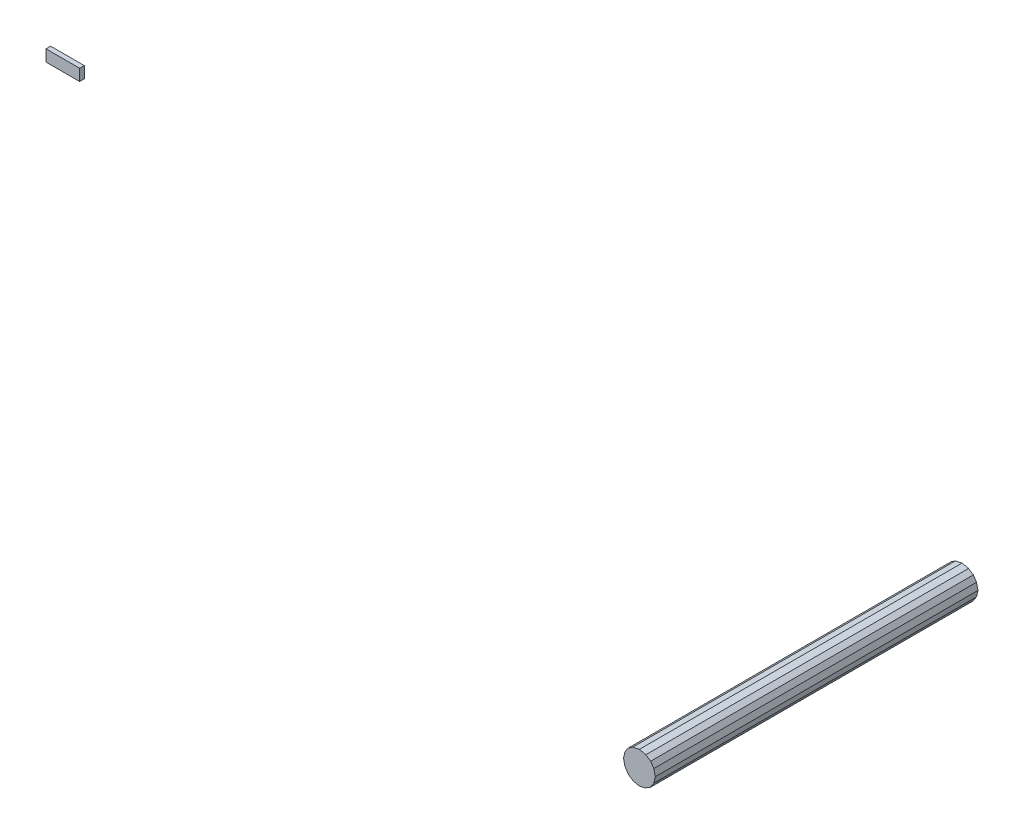
ISO-10303-21;
HEADER;
FILE_DESCRIPTION(('STEP AP214'),'2;1');
FILE_NAME('part.step','',(''),(''),'','','');
FILE_SCHEMA(('AUTOMOTIVE_DESIGN { 1 0 10303 214 1 1 1 1 }'));
ENDSEC;
DATA;
#1=APPLICATION_CONTEXT('core data for automotive mechanical design processes');
#2=APPLICATION_PROTOCOL_DEFINITION('international standard','automotive_design',2000,#1);
#3=PRODUCT_CONTEXT('',#1,'mechanical');
#4=PRODUCT('Part','Part','',(#3));
#5=PRODUCT_RELATED_PRODUCT_CATEGORY('part','',(#4));
#6=PRODUCT_DEFINITION_FORMATION('','',#4);
#7=PRODUCT_DEFINITION_CONTEXT('part definition',#1,'design');
#8=PRODUCT_DEFINITION('design','',#6,#7);
#9=PRODUCT_DEFINITION_SHAPE('','',#8);
#10=(LENGTH_UNIT() NAMED_UNIT(*) SI_UNIT(.MILLI.,.METRE.));
#11=(NAMED_UNIT(*) PLANE_ANGLE_UNIT() SI_UNIT($,.RADIAN.));
#12=(NAMED_UNIT(*) SI_UNIT($,.STERADIAN.) SOLID_ANGLE_UNIT());
#13=UNCERTAINTY_MEASURE_WITH_UNIT(LENGTH_MEASURE(1.E-05),#10,'distance_accuracy_value','');
#14=(GEOMETRIC_REPRESENTATION_CONTEXT(3) GLOBAL_UNCERTAINTY_ASSIGNED_CONTEXT((#13)) GLOBAL_UNIT_ASSIGNED_CONTEXT((#10,
#11,#12)) REPRESENTATION_CONTEXT('',''));
#15=CARTESIAN_POINT('',(0.,0.,0.));
#16=DIRECTION('',(0.,0.,1.));
#17=DIRECTION('',(1.,0.,0.));
#18=AXIS2_PLACEMENT_3D('',#15,#16,#17);
#19=CARTESIAN_POINT('',(34.573680678242,15.369889449512,9.000000650735));
#20=DIRECTION('',(0.,0.,1.));
#21=DIRECTION('',(1.,0.,0.));
#22=AXIS2_PLACEMENT_3D('',#19,#20,#21);
#23=PLANE('',#22);
#24=DIRECTION('',(-0.860789441871855,-0.508961233063914,0.));
#25=VECTOR('',#24,1.);
#26=CARTESIAN_POINT('',(34.754706478242,15.476925049512,9.000000650735));
#27=LINE('',#26,#25);
#28=CARTESIAN_POINT('',(34.754706478242,15.476925049512,9.000000650735));
#29=VERTEX_POINT('',#28);
#30=CARTESIAN_POINT('',(34.573680678242,15.369889449512,9.000000650735));
#31=VERTEX_POINT('',#30);
#32=EDGE_CURVE('P0_E26',#29,#31,#27,.T.);
#33=ORIENTED_EDGE('',*,*,#32,.F.);
#34=DIRECTION('',(-0.539246404118153,-0.842148036657239,0.));
#35=VECTOR('',#34,1.);
#36=CARTESIAN_POINT('',(34.865628278242,15.650153049512,9.000000650735));
#37=LINE('',#36,#35);
#38=CARTESIAN_POINT('',(34.865628278242,15.650153049512,9.000000650735));
#39=VERTEX_POINT('',#38);
#40=EDGE_CURVE('P0_E184',#39,#29,#37,.T.);
#41=ORIENTED_EDGE('',*,*,#40,.F.);
#42=DIRECTION('',(-0.707106781186548,-0.707106781186548,0.));
#43=VECTOR('',#42,1.);
#44=CARTESIAN_POINT('',(34.875381878242,15.659906649512,9.000000650735));
#45=LINE('',#44,#43);
#46=CARTESIAN_POINT('',(34.875381878242,15.659906649512,9.000000650735));
#47=VERTEX_POINT('',#46);
#48=EDGE_CURVE('P0_E186',#47,#39,#45,.T.);
#49=ORIENTED_EDGE('',*,*,#48,.F.);
#50=DIRECTION('',(-0.228497344288947,-0.973544536039774,0.));
#51=VECTOR('',#50,1.);
#52=CARTESIAN_POINT('',(34.927909078242,15.883706049512,9.000000650735));
#53=LINE('',#52,#51);
#54=CARTESIAN_POINT('',(34.927909078242,15.883706049512,9.000000650735));
#55=VERTEX_POINT('',#54);
#56=EDGE_CURVE('P0_E214',#55,#47,#53,.T.);
#57=ORIENTED_EDGE('',*,*,#56,.F.);
#58=DIRECTION('',(0.234264017035985,-0.972173014602938,0.));
#59=VECTOR('',#58,1.);
#60=CARTESIAN_POINT('',(34.875381878242,16.101688849512,9.000000650735));
#61=LINE('',#60,#59);
#62=CARTESIAN_POINT('',(34.875381878242,16.101688849512,9.000000650735));
#63=VERTEX_POINT('',#62);
#64=EDGE_CURVE('P0_E220',#63,#55,#61,.T.);
#65=ORIENTED_EDGE('',*,*,#64,.F.);
#66=DIRECTION('',(0.545689782249991,-0.837987268129986,0.));
#67=VECTOR('',#66,1.);
#68=CARTESIAN_POINT('',(34.766365078242,16.269100249512,9.000000650735));
#69=LINE('',#68,#67);
#70=CARTESIAN_POINT('',(34.766365078242,16.269100249512,9.000000650735));
#71=VERTEX_POINT('',#70);
#72=EDGE_CURVE('P0_E228',#71,#63,#69,.T.);
#73=ORIENTED_EDGE('',*,*,#72,.F.);
#74=DIRECTION('',(0.838007550608019,-0.545658634243012,0.));
#75=VECTOR('',#74,1.);
#76=CARTESIAN_POINT('',(34.598979078242,16.378091649512,9.000000650735));
#77=LINE('',#76,#75);
#78=CARTESIAN_POINT('',(34.598979078242,16.378091649512,9.000000650735));
#79=VERTEX_POINT('',#78);
#80=EDGE_CURVE('P0_E236',#79,#71,#77,.T.);
#81=ORIENTED_EDGE('',*,*,#80,.F.);
#82=DIRECTION('',(0.975388808551702,-0.220491886816932,0.));
#83=VECTOR('',#82,1.);
#84=CARTESIAN_POINT('',(34.375154278242,16.428688449512,9.000000650735));
#85=LINE('',#84,#83);
#86=CARTESIAN_POINT('',(34.375154278242,16.428688449512,9.000000650735));
#87=VERTEX_POINT('',#86);
#88=EDGE_CURVE('P0_E244',#87,#79,#85,.T.);
#89=ORIENTED_EDGE('',*,*,#88,.F.);
#90=DIRECTION('',(0.977328638870001,0.211727966137001,0.));
#91=VECTOR('',#90,1.);
#92=CARTESIAN_POINT('',(34.141601278242,16.378091649512,9.000000650735));
#93=LINE('',#92,#91);
#94=CARTESIAN_POINT('',(34.141601278242,16.378091649512,9.000000650735));
#95=VERTEX_POINT('',#94);
#96=EDGE_CURVE('P0_E252',#95,#87,#93,.T.);
#97=ORIENTED_EDGE('',*,*,#96,.F.);
#98=DIRECTION('',(0.825574759558204,0.564292757689139,0.));
#99=VECTOR('',#98,1.);
#100=CARTESIAN_POINT('',(33.987829678242,16.272986449512,9.000000650735));
#101=LINE('',#100,#99);
#102=CARTESIAN_POINT('',(33.987829678242,16.272986449512,9.000000650735));
#103=VERTEX_POINT('',#102);
#104=EDGE_CURVE('P0_E260',#103,#95,#101,.T.);
#105=ORIENTED_EDGE('',*,*,#104,.F.);
#106=DIRECTION('',(0.57474998902595,0.818329059800928,0.));
#107=VECTOR('',#106,1.);
#108=CARTESIAN_POINT('',(33.872996278242,16.109486649512,9.000000650735));
#109=LINE('',#108,#107);
#110=CARTESIAN_POINT('',(33.872996278242,16.109486649512,9.000000650735));
#111=VERTEX_POINT('',#110);
#112=EDGE_CURVE('P0_E268',#111,#103,#109,.T.);
#113=ORIENTED_EDGE('',*,*,#112,.F.);
#114=DIRECTION('',(0.220491886816932,0.975388808551702,0.));
#115=VECTOR('',#114,1.);
#116=CARTESIAN_POINT('',(33.822399478242,15.885661849512,9.000000650735));
#117=LINE('',#116,#115);
#118=CARTESIAN_POINT('',(33.822399478242,15.885661849512,9.000000650735));
#119=VERTEX_POINT('',#118);
#120=EDGE_CURVE('P0_E276',#119,#111,#117,.T.);
#121=ORIENTED_EDGE('',*,*,#120,.F.);
#122=DIRECTION('',(-0.220491886816932,0.975388808551702,0.));
#123=VECTOR('',#122,1.);
#124=CARTESIAN_POINT('',(33.872996278242,15.661837049512,9.000000650735));
#125=LINE('',#124,#123);
#126=CARTESIAN_POINT('',(33.872996278242,15.661837049512,9.000000650735));
#127=VERTEX_POINT('',#126);
#128=EDGE_CURVE('P0_E284',#127,#119,#125,.T.);
#129=ORIENTED_EDGE('',*,*,#128,.F.);
#130=DIRECTION('',(-0.560904658136019,0.827880404697028,0.));
#131=VECTOR('',#130,1.);
#132=CARTESIAN_POINT('',(33.995627478242,15.480836649512,9.000000650735));
#133=LINE('',#132,#131);
#134=CARTESIAN_POINT('',(33.995627478242,15.480836649512,9.000000650735));
#135=VERTEX_POINT('',#134);
#136=EDGE_CURVE('P0_E292',#135,#127,#133,.T.);
#137=ORIENTED_EDGE('',*,*,#136,.F.);
#138=DIRECTION('',(-0.836425426544044,0.548080747546029,0.));
#139=VECTOR('',#138,1.);
#140=CARTESIAN_POINT('',(34.164943878242,15.369889449512,9.000000650735));
#141=LINE('',#140,#139);
#142=CARTESIAN_POINT('',(34.164943878242,15.369889449512,9.000000650735));
#143=VERTEX_POINT('',#142);
#144=EDGE_CURVE('P0_E300',#143,#135,#141,.T.);
#145=ORIENTED_EDGE('',*,*,#144,.F.);
#146=DIRECTION('',(-0.972798430578044,0.23165321811901,0.));
#147=VECTOR('',#146,1.);
#148=CARTESIAN_POINT('',(34.369312278242,15.321223049512,9.000000650735));
#149=LINE('',#148,#147);
#150=CARTESIAN_POINT('',(34.369312278242,15.321223049512,9.000000650735));
#151=VERTEX_POINT('',#150);
#152=EDGE_CURVE('P0_E65',#151,#143,#149,.T.);
#153=ORIENTED_EDGE('',*,*,#152,.F.);
#154=DIRECTION('',(-0.972798430578044,-0.23165321811901,0.));
#155=VECTOR('',#154,1.);
#156=CARTESIAN_POINT('',(34.573680678242,15.369889449512,9.000000650735));
#157=LINE('',#156,#155);
#158=EDGE_CURVE('P0_E313',#31,#151,#157,.T.);
#159=ORIENTED_EDGE('',*,*,#158,.F.);
#160=EDGE_LOOP('',(#33,#41,#49,#57,#65,#73,#81,#89,#97,#105,#113,#121,#129,#137,#145,#153,#159));
#161=FACE_BOUND('',#160,.T.);
#162=ADVANCED_FACE('P0_F16',(#161),#23,.T.);
#163=CARTESIAN_POINT('',(34.573680678242,15.369889449512,-2.199999809265));
#164=DIRECTION('',(0.,0.,1.));
#165=DIRECTION('',(1.,0.,0.));
#166=AXIS2_PLACEMENT_3D('',#163,#164,#165);
#167=PLANE('',#166);
#168=DIRECTION('',(-0.972798430578044,-0.23165321811901,0.));
#169=VECTOR('',#168,1.);
#170=CARTESIAN_POINT('',(34.573680678242,15.369889449512,-2.199999809265));
#171=LINE('',#170,#169);
#172=CARTESIAN_POINT('',(34.573680678242,15.369889449512,-2.199999809265));
#173=VERTEX_POINT('',#172);
#174=CARTESIAN_POINT('',(34.369312278242,15.321223049512,-2.199999809265));
#175=VERTEX_POINT('',#174);
#176=EDGE_CURVE('P0_E311',#173,#175,#171,.T.);
#177=ORIENTED_EDGE('',*,*,#176,.T.);
#178=DIRECTION('',(-0.972798430578044,0.23165321811901,0.));
#179=VECTOR('',#178,1.);
#180=CARTESIAN_POINT('',(34.369312278242,15.321223049512,-2.199999809265));
#181=LINE('',#180,#179);
#182=CARTESIAN_POINT('',(34.164943878242,15.369889449512,-2.199999809265));
#183=VERTEX_POINT('',#182);
#184=EDGE_CURVE('P0_E305',#175,#183,#181,.T.);
#185=ORIENTED_EDGE('',*,*,#184,.T.);
#186=DIRECTION('',(-0.836425426544044,0.548080747546029,0.));
#187=VECTOR('',#186,1.);
#188=CARTESIAN_POINT('',(34.164943878242,15.369889449512,-2.199999809265));
#189=LINE('',#188,#187);
#190=CARTESIAN_POINT('',(33.995627478242,15.480836649512,-2.199999809265));
#191=VERTEX_POINT('',#190);
#192=EDGE_CURVE('P0_E297',#183,#191,#189,.T.);
#193=ORIENTED_EDGE('',*,*,#192,.T.);
#194=DIRECTION('',(-0.560904658136019,0.827880404697028,0.));
#195=VECTOR('',#194,1.);
#196=CARTESIAN_POINT('',(33.995627478242,15.480836649512,-2.199999809265));
#197=LINE('',#196,#195);
#198=CARTESIAN_POINT('',(33.872996278242,15.661837049512,-2.199999809265));
#199=VERTEX_POINT('',#198);
#200=EDGE_CURVE('P0_E289',#191,#199,#197,.T.);
#201=ORIENTED_EDGE('',*,*,#200,.T.);
#202=DIRECTION('',(-0.220491886816932,0.975388808551702,0.));
#203=VECTOR('',#202,1.);
#204=CARTESIAN_POINT('',(33.872996278242,15.661837049512,-2.199999809265));
#205=LINE('',#204,#203);
#206=CARTESIAN_POINT('',(33.822399478242,15.885661849512,-2.199999809265));
#207=VERTEX_POINT('',#206);
#208=EDGE_CURVE('P0_E281',#199,#207,#205,.T.);
#209=ORIENTED_EDGE('',*,*,#208,.T.);
#210=DIRECTION('',(0.220491886816932,0.975388808551702,0.));
#211=VECTOR('',#210,1.);
#212=CARTESIAN_POINT('',(33.822399478242,15.885661849512,-2.199999809265));
#213=LINE('',#212,#211);
#214=CARTESIAN_POINT('',(33.872996278242,16.109486649512,-2.199999809265));
#215=VERTEX_POINT('',#214);
#216=EDGE_CURVE('P0_E273',#207,#215,#213,.T.);
#217=ORIENTED_EDGE('',*,*,#216,.T.);
#218=DIRECTION('',(0.57474998902595,0.818329059800928,0.));
#219=VECTOR('',#218,1.);
#220=CARTESIAN_POINT('',(33.872996278242,16.109486649512,-2.199999809265));
#221=LINE('',#220,#219);
#222=CARTESIAN_POINT('',(33.987829678242,16.272986449512,-2.199999809265));
#223=VERTEX_POINT('',#222);
#224=EDGE_CURVE('P0_E265',#215,#223,#221,.T.);
#225=ORIENTED_EDGE('',*,*,#224,.T.);
#226=DIRECTION('',(0.825574759558204,0.564292757689139,0.));
#227=VECTOR('',#226,1.);
#228=CARTESIAN_POINT('',(33.987829678242,16.272986449512,-2.199999809265));
#229=LINE('',#228,#227);
#230=CARTESIAN_POINT('',(34.141601278242,16.378091649512,-2.199999809265));
#231=VERTEX_POINT('',#230);
#232=EDGE_CURVE('P0_E257',#223,#231,#229,.T.);
#233=ORIENTED_EDGE('',*,*,#232,.T.);
#234=DIRECTION('',(0.977328638870001,0.211727966137001,0.));
#235=VECTOR('',#234,1.);
#236=CARTESIAN_POINT('',(34.141601278242,16.378091649512,-2.199999809265));
#237=LINE('',#236,#235);
#238=CARTESIAN_POINT('',(34.375154278242,16.428688449512,-2.199999809265));
#239=VERTEX_POINT('',#238);
#240=EDGE_CURVE('P0_E249',#231,#239,#237,.T.);
#241=ORIENTED_EDGE('',*,*,#240,.T.);
#242=DIRECTION('',(0.975388808551702,-0.220491886816932,0.));
#243=VECTOR('',#242,1.);
#244=CARTESIAN_POINT('',(34.375154278242,16.428688449512,-2.199999809265));
#245=LINE('',#244,#243);
#246=CARTESIAN_POINT('',(34.598979078242,16.378091649512,-2.199999809265));
#247=VERTEX_POINT('',#246);
#248=EDGE_CURVE('P0_E241',#239,#247,#245,.T.);
#249=ORIENTED_EDGE('',*,*,#248,.T.);
#250=DIRECTION('',(0.838007550608019,-0.545658634243012,0.));
#251=VECTOR('',#250,1.);
#252=CARTESIAN_POINT('',(34.598979078242,16.378091649512,-2.199999809265));
#253=LINE('',#252,#251);
#254=CARTESIAN_POINT('',(34.766365078242,16.269100249512,-2.199999809265));
#255=VERTEX_POINT('',#254);
#256=EDGE_CURVE('P0_E233',#247,#255,#253,.T.);
#257=ORIENTED_EDGE('',*,*,#256,.T.);
#258=DIRECTION('',(0.545689782249991,-0.837987268129986,0.));
#259=VECTOR('',#258,1.);
#260=CARTESIAN_POINT('',(34.766365078242,16.269100249512,-2.199999809265));
#261=LINE('',#260,#259);
#262=CARTESIAN_POINT('',(34.875381878242,16.101688849512,-2.199999809265));
#263=VERTEX_POINT('',#262);
#264=EDGE_CURVE('P0_E225',#255,#263,#261,.T.);
#265=ORIENTED_EDGE('',*,*,#264,.T.);
#266=DIRECTION('',(0.234264017035985,-0.972173014602938,0.));
#267=VECTOR('',#266,1.);
#268=CARTESIAN_POINT('',(34.875381878242,16.101688849512,-2.199999809265));
#269=LINE('',#268,#267);
#270=CARTESIAN_POINT('',(34.927909078242,15.883706049512,-2.199999809265));
#271=VERTEX_POINT('',#270);
#272=EDGE_CURVE('P0_E217',#263,#271,#269,.T.);
#273=ORIENTED_EDGE('',*,*,#272,.T.);
#274=DIRECTION('',(-0.228497344288947,-0.973544536039774,0.));
#275=VECTOR('',#274,1.);
#276=CARTESIAN_POINT('',(34.927909078242,15.883706049512,-2.199999809265));
#277=LINE('',#276,#275);
#278=CARTESIAN_POINT('',(34.875381878242,15.659906649512,-2.199999809265));
#279=VERTEX_POINT('',#278);
#280=EDGE_CURVE('P0_E203',#271,#279,#277,.T.);
#281=ORIENTED_EDGE('',*,*,#280,.T.);
#282=DIRECTION('',(-0.707106781186548,-0.707106781186548,0.));
#283=VECTOR('',#282,1.);
#284=CARTESIAN_POINT('',(34.875381878242,15.659906649512,-2.199999809265));
#285=LINE('',#284,#283);
#286=CARTESIAN_POINT('',(34.865628278242,15.650153049512,-2.199999809265));
#287=VERTEX_POINT('',#286);
#288=EDGE_CURVE('P0_E190',#279,#287,#285,.T.);
#289=ORIENTED_EDGE('',*,*,#288,.T.);
#290=DIRECTION('',(-0.539246404118153,-0.842148036657239,0.));
#291=VECTOR('',#290,1.);
#292=CARTESIAN_POINT('',(34.865628278242,15.650153049512,-2.199999809265));
#293=LINE('',#292,#291);
#294=CARTESIAN_POINT('',(34.754706478242,15.476925049512,-2.199999809265));
#295=VERTEX_POINT('',#294);
#296=EDGE_CURVE('P0_E179',#287,#295,#293,.T.);
#297=ORIENTED_EDGE('',*,*,#296,.T.);
#298=DIRECTION('',(-0.860789441871855,-0.508961233063914,0.));
#299=VECTOR('',#298,1.);
#300=CARTESIAN_POINT('',(34.754706478242,15.476925049512,-2.199999809265));
#301=LINE('',#300,#299);
#302=EDGE_CURVE('P0_E11',#295,#173,#301,.T.);
#303=ORIENTED_EDGE('',*,*,#302,.T.);
#304=EDGE_LOOP('',(#177,#185,#193,#201,#209,#217,#225,#233,#241,#249,#257,#265,#273,#281,#289,
#297,#303));
#305=FACE_BOUND('',#304,.T.);
#306=ADVANCED_FACE('P0_F501',(#305),#167,.F.);
#307=CARTESIAN_POINT('',(34.754706478242,15.476925049512,-2.199999809265));
#308=DIRECTION('',(0.508961233063914,-0.860789441871855,0.));
#309=DIRECTION('',(-0.860789441871855,-0.508961233063914,0.));
#310=AXIS2_PLACEMENT_3D('',#307,#308,#309);
#311=PLANE('',#310);
#312=DIRECTION('',(0.,0.,1.));
#313=VECTOR('',#312,1.);
#314=CARTESIAN_POINT('',(34.754706478242,15.476925049512,-2.199999809265));
#315=LINE('',#314,#313);
#316=EDGE_CURVE('P0_E189',#295,#29,#315,.T.);
#317=ORIENTED_EDGE('',*,*,#316,.T.);
#318=ORIENTED_EDGE('',*,*,#32,.T.);
#319=DIRECTION('',(0.,0.,1.));
#320=VECTOR('',#319,1.);
#321=CARTESIAN_POINT('',(34.573680678242,15.369889449512,-2.199999809265));
#322=LINE('',#321,#320);
#323=EDGE_CURVE('P0_E317',#173,#31,#322,.T.);
#324=ORIENTED_EDGE('',*,*,#323,.F.);
#325=ORIENTED_EDGE('',*,*,#302,.F.);
#326=EDGE_LOOP('',(#317,#318,#324,#325));
#327=FACE_BOUND('',#326,.T.);
#328=ADVANCED_FACE('P0_F499',(#327),#311,.T.);
#329=CARTESIAN_POINT('',(34.865628278242,15.650153049512,-2.199999809265));
#330=DIRECTION('',(0.842148036657239,-0.539246404118153,0.));
#331=DIRECTION('',(-0.539246404118153,-0.842148036657239,0.));
#332=AXIS2_PLACEMENT_3D('',#329,#330,#331);
#333=PLANE('',#332);
#334=DIRECTION('',(0.,0.,1.));
#335=VECTOR('',#334,1.);
#336=CARTESIAN_POINT('',(34.865628278242,15.650153049512,-2.199999809265));
#337=LINE('',#336,#335);
#338=EDGE_CURVE('P0_E193',#287,#39,#337,.T.);
#339=ORIENTED_EDGE('',*,*,#338,.T.);
#340=ORIENTED_EDGE('',*,*,#40,.T.);
#341=ORIENTED_EDGE('',*,*,#316,.F.);
#342=ORIENTED_EDGE('',*,*,#296,.F.);
#343=EDGE_LOOP('',(#339,#340,#341,#342));
#344=FACE_BOUND('',#343,.T.);
#345=ADVANCED_FACE('P0_F194',(#344),#333,.T.);
#346=CARTESIAN_POINT('',(34.875381878242,15.659906649512,-2.199999809265));
#347=DIRECTION('',(0.707106781186548,-0.707106781186548,0.));
#348=DIRECTION('',(-0.707106781186548,-0.707106781186548,0.));
#349=AXIS2_PLACEMENT_3D('',#346,#347,#348);
#350=PLANE('',#349);
#351=DIRECTION('',(0.,0.,1.));
#352=VECTOR('',#351,1.);
#353=CARTESIAN_POINT('',(34.875381878242,15.659906649512,-2.199999809265));
#354=LINE('',#353,#352);
#355=EDGE_CURVE('P0_E200',#279,#47,#354,.T.);
#356=ORIENTED_EDGE('',*,*,#355,.T.);
#357=ORIENTED_EDGE('',*,*,#48,.T.);
#358=ORIENTED_EDGE('',*,*,#338,.F.);
#359=ORIENTED_EDGE('',*,*,#288,.F.);
#360=EDGE_LOOP('',(#356,#357,#358,#359));
#361=FACE_BOUND('',#360,.T.);
#362=ADVANCED_FACE('P0_F198',(#361),#350,.T.);
#363=CARTESIAN_POINT('',(34.927909078242,15.883706049512,-2.199999809265));
#364=DIRECTION('',(0.973544536039774,-0.228497344288947,0.));
#365=DIRECTION('',(-0.228497344288947,-0.973544536039774,0.));
#366=AXIS2_PLACEMENT_3D('',#363,#364,#365);
#367=PLANE('',#366);
#368=DIRECTION('',(0.,0.,1.));
#369=VECTOR('',#368,1.);
#370=CARTESIAN_POINT('',(34.927909078242,15.883706049512,-2.199999809265));
#371=LINE('',#370,#369);
#372=EDGE_CURVE('P0_E224',#271,#55,#371,.T.);
#373=ORIENTED_EDGE('',*,*,#372,.T.);
#374=ORIENTED_EDGE('',*,*,#56,.T.);
#375=ORIENTED_EDGE('',*,*,#355,.F.);
#376=ORIENTED_EDGE('',*,*,#280,.F.);
#377=EDGE_LOOP('',(#373,#374,#375,#376));
#378=FACE_BOUND('',#377,.T.);
#379=ADVANCED_FACE('P0_F543',(#378),#367,.T.);
#380=CARTESIAN_POINT('',(34.875381878242,16.101688849512,-2.199999809265));
#381=DIRECTION('',(0.972173014602938,0.234264017035985,0.));
#382=DIRECTION('',(0.234264017035985,-0.972173014602938,0.));
#383=AXIS2_PLACEMENT_3D('',#380,#381,#382);
#384=PLANE('',#383);
#385=DIRECTION('',(0.,0.,1.));
#386=VECTOR('',#385,1.);
#387=CARTESIAN_POINT('',(34.875381878242,16.101688849512,-2.199999809265));
#388=LINE('',#387,#386);
#389=EDGE_CURVE('P0_E232',#263,#63,#388,.T.);
#390=ORIENTED_EDGE('',*,*,#389,.T.);
#391=ORIENTED_EDGE('',*,*,#64,.T.);
#392=ORIENTED_EDGE('',*,*,#372,.F.);
#393=ORIENTED_EDGE('',*,*,#272,.F.);
#394=EDGE_LOOP('',(#390,#391,#392,#393));
#395=FACE_BOUND('',#394,.T.);
#396=ADVANCED_FACE('P0_F553',(#395),#384,.T.);
#397=CARTESIAN_POINT('',(34.766365078242,16.269100249512,-2.199999809265));
#398=DIRECTION('',(0.837987268129986,0.545689782249991,0.));
#399=DIRECTION('',(0.545689782249991,-0.837987268129986,0.));
#400=AXIS2_PLACEMENT_3D('',#397,#398,#399);
#401=PLANE('',#400);
#402=DIRECTION('',(0.,0.,1.));
#403=VECTOR('',#402,1.);
#404=CARTESIAN_POINT('',(34.766365078242,16.269100249512,-2.199999809265));
#405=LINE('',#404,#403);
#406=EDGE_CURVE('P0_E240',#255,#71,#405,.T.);
#407=ORIENTED_EDGE('',*,*,#406,.T.);
#408=ORIENTED_EDGE('',*,*,#72,.T.);
#409=ORIENTED_EDGE('',*,*,#389,.F.);
#410=ORIENTED_EDGE('',*,*,#264,.F.);
#411=EDGE_LOOP('',(#407,#408,#409,#410));
#412=FACE_BOUND('',#411,.T.);
#413=ADVANCED_FACE('P0_F564',(#412),#401,.T.);
#414=CARTESIAN_POINT('',(34.598979078242,16.378091649512,-2.199999809265));
#415=DIRECTION('',(0.545658634243012,0.838007550608019,0.));
#416=DIRECTION('',(0.838007550608019,-0.545658634243012,0.));
#417=AXIS2_PLACEMENT_3D('',#414,#415,#416);
#418=PLANE('',#417);
#419=DIRECTION('',(0.,0.,1.));
#420=VECTOR('',#419,1.);
#421=CARTESIAN_POINT('',(34.598979078242,16.378091649512,-2.199999809265));
#422=LINE('',#421,#420);
#423=EDGE_CURVE('P0_E248',#247,#79,#422,.T.);
#424=ORIENTED_EDGE('',*,*,#423,.T.);
#425=ORIENTED_EDGE('',*,*,#80,.T.);
#426=ORIENTED_EDGE('',*,*,#406,.F.);
#427=ORIENTED_EDGE('',*,*,#256,.F.);
#428=EDGE_LOOP('',(#424,#425,#426,#427));
#429=FACE_BOUND('',#428,.T.);
#430=ADVANCED_FACE('P0_F575',(#429),#418,.T.);
#431=CARTESIAN_POINT('',(34.375154278242,16.428688449512,-2.199999809265));
#432=DIRECTION('',(0.220491886816932,0.975388808551702,0.));
#433=DIRECTION('',(0.975388808551702,-0.220491886816932,0.));
#434=AXIS2_PLACEMENT_3D('',#431,#432,#433);
#435=PLANE('',#434);
#436=DIRECTION('',(0.,0.,1.));
#437=VECTOR('',#436,1.);
#438=CARTESIAN_POINT('',(34.375154278242,16.428688449512,-2.199999809265));
#439=LINE('',#438,#437);
#440=EDGE_CURVE('P0_E256',#239,#87,#439,.T.);
#441=ORIENTED_EDGE('',*,*,#440,.T.);
#442=ORIENTED_EDGE('',*,*,#88,.T.);
#443=ORIENTED_EDGE('',*,*,#423,.F.);
#444=ORIENTED_EDGE('',*,*,#248,.F.);
#445=EDGE_LOOP('',(#441,#442,#443,#444));
#446=FACE_BOUND('',#445,.T.);
#447=ADVANCED_FACE('P0_F586',(#446),#435,.T.);
#448=CARTESIAN_POINT('',(34.141601278242,16.378091649512,-2.199999809265));
#449=DIRECTION('',(-0.211727966137001,0.977328638870001,0.));
#450=DIRECTION('',(0.977328638870001,0.211727966137001,0.));
#451=AXIS2_PLACEMENT_3D('',#448,#449,#450);
#452=PLANE('',#451);
#453=DIRECTION('',(0.,0.,1.));
#454=VECTOR('',#453,1.);
#455=CARTESIAN_POINT('',(34.141601278242,16.378091649512,-2.199999809265));
#456=LINE('',#455,#454);
#457=EDGE_CURVE('P0_E264',#231,#95,#456,.T.);
#458=ORIENTED_EDGE('',*,*,#457,.T.);
#459=ORIENTED_EDGE('',*,*,#96,.T.);
#460=ORIENTED_EDGE('',*,*,#440,.F.);
#461=ORIENTED_EDGE('',*,*,#240,.F.);
#462=EDGE_LOOP('',(#458,#459,#460,#461));
#463=FACE_BOUND('',#462,.T.);
#464=ADVANCED_FACE('P0_F597',(#463),#452,.T.);
#465=CARTESIAN_POINT('',(33.987829678242,16.272986449512,-2.199999809265));
#466=DIRECTION('',(-0.564292757689139,0.825574759558204,0.));
#467=DIRECTION('',(0.825574759558204,0.564292757689139,0.));
#468=AXIS2_PLACEMENT_3D('',#465,#466,#467);
#469=PLANE('',#468);
#470=DIRECTION('',(0.,0.,1.));
#471=VECTOR('',#470,1.);
#472=CARTESIAN_POINT('',(33.987829678242,16.272986449512,-2.199999809265));
#473=LINE('',#472,#471);
#474=EDGE_CURVE('P0_E272',#223,#103,#473,.T.);
#475=ORIENTED_EDGE('',*,*,#474,.T.);
#476=ORIENTED_EDGE('',*,*,#104,.T.);
#477=ORIENTED_EDGE('',*,*,#457,.F.);
#478=ORIENTED_EDGE('',*,*,#232,.F.);
#479=EDGE_LOOP('',(#475,#476,#477,#478));
#480=FACE_BOUND('',#479,.T.);
#481=ADVANCED_FACE('P0_F608',(#480),#469,.T.);
#482=CARTESIAN_POINT('',(33.872996278242,16.109486649512,-2.199999809265));
#483=DIRECTION('',(-0.818329059800928,0.57474998902595,0.));
#484=DIRECTION('',(0.57474998902595,0.818329059800928,0.));
#485=AXIS2_PLACEMENT_3D('',#482,#483,#484);
#486=PLANE('',#485);
#487=DIRECTION('',(0.,0.,1.));
#488=VECTOR('',#487,1.);
#489=CARTESIAN_POINT('',(33.872996278242,16.109486649512,-2.199999809265));
#490=LINE('',#489,#488);
#491=EDGE_CURVE('P0_E280',#215,#111,#490,.T.);
#492=ORIENTED_EDGE('',*,*,#491,.T.);
#493=ORIENTED_EDGE('',*,*,#112,.T.);
#494=ORIENTED_EDGE('',*,*,#474,.F.);
#495=ORIENTED_EDGE('',*,*,#224,.F.);
#496=EDGE_LOOP('',(#492,#493,#494,#495));
#497=FACE_BOUND('',#496,.T.);
#498=ADVANCED_FACE('P0_F619',(#497),#486,.T.);
#499=CARTESIAN_POINT('',(33.822399478242,15.885661849512,-2.199999809265));
#500=DIRECTION('',(-0.975388808551702,0.220491886816932,0.));
#501=DIRECTION('',(0.220491886816932,0.975388808551702,0.));
#502=AXIS2_PLACEMENT_3D('',#499,#500,#501);
#503=PLANE('',#502);
#504=DIRECTION('',(0.,0.,1.));
#505=VECTOR('',#504,1.);
#506=CARTESIAN_POINT('',(33.822399478242,15.885661849512,-2.199999809265));
#507=LINE('',#506,#505);
#508=EDGE_CURVE('P0_E288',#207,#119,#507,.T.);
#509=ORIENTED_EDGE('',*,*,#508,.T.);
#510=ORIENTED_EDGE('',*,*,#120,.T.);
#511=ORIENTED_EDGE('',*,*,#491,.F.);
#512=ORIENTED_EDGE('',*,*,#216,.F.);
#513=EDGE_LOOP('',(#509,#510,#511,#512));
#514=FACE_BOUND('',#513,.T.);
#515=ADVANCED_FACE('P0_F630',(#514),#503,.T.);
#516=CARTESIAN_POINT('',(33.872996278242,15.661837049512,-2.199999809265));
#517=DIRECTION('',(-0.975388808551702,-0.220491886816932,0.));
#518=DIRECTION('',(-0.220491886816932,0.975388808551702,0.));
#519=AXIS2_PLACEMENT_3D('',#516,#517,#518);
#520=PLANE('',#519);
#521=DIRECTION('',(0.,0.,1.));
#522=VECTOR('',#521,1.);
#523=CARTESIAN_POINT('',(33.872996278242,15.661837049512,-2.199999809265));
#524=LINE('',#523,#522);
#525=EDGE_CURVE('P0_E296',#199,#127,#524,.T.);
#526=ORIENTED_EDGE('',*,*,#525,.T.);
#527=ORIENTED_EDGE('',*,*,#128,.T.);
#528=ORIENTED_EDGE('',*,*,#508,.F.);
#529=ORIENTED_EDGE('',*,*,#208,.F.);
#530=EDGE_LOOP('',(#526,#527,#528,#529));
#531=FACE_BOUND('',#530,.T.);
#532=ADVANCED_FACE('P0_F641',(#531),#520,.T.);
#533=CARTESIAN_POINT('',(33.995627478242,15.480836649512,-2.199999809265));
#534=DIRECTION('',(-0.827880404697028,-0.560904658136019,0.));
#535=DIRECTION('',(-0.560904658136019,0.827880404697028,0.));
#536=AXIS2_PLACEMENT_3D('',#533,#534,#535);
#537=PLANE('',#536);
#538=DIRECTION('',(0.,0.,1.));
#539=VECTOR('',#538,1.);
#540=CARTESIAN_POINT('',(33.995627478242,15.480836649512,-2.199999809265));
#541=LINE('',#540,#539);
#542=EDGE_CURVE('P0_E304',#191,#135,#541,.T.);
#543=ORIENTED_EDGE('',*,*,#542,.T.);
#544=ORIENTED_EDGE('',*,*,#136,.T.);
#545=ORIENTED_EDGE('',*,*,#525,.F.);
#546=ORIENTED_EDGE('',*,*,#200,.F.);
#547=EDGE_LOOP('',(#543,#544,#545,#546));
#548=FACE_BOUND('',#547,.T.);
#549=ADVANCED_FACE('P0_F652',(#548),#537,.T.);
#550=CARTESIAN_POINT('',(34.164943878242,15.369889449512,-2.199999809265));
#551=DIRECTION('',(-0.548080747546029,-0.836425426544044,0.));
#552=DIRECTION('',(-0.836425426544044,0.548080747546029,0.));
#553=AXIS2_PLACEMENT_3D('',#550,#551,#552);
#554=PLANE('',#553);
#555=DIRECTION('',(0.,0.,1.));
#556=VECTOR('',#555,1.);
#557=CARTESIAN_POINT('',(34.164943878242,15.369889449512,-2.199999809265));
#558=LINE('',#557,#556);
#559=EDGE_CURVE('P0_E310',#183,#143,#558,.T.);
#560=ORIENTED_EDGE('',*,*,#559,.T.);
#561=ORIENTED_EDGE('',*,*,#144,.T.);
#562=ORIENTED_EDGE('',*,*,#542,.F.);
#563=ORIENTED_EDGE('',*,*,#192,.F.);
#564=EDGE_LOOP('',(#560,#561,#562,#563));
#565=FACE_BOUND('',#564,.T.);
#566=ADVANCED_FACE('P0_F494',(#565),#554,.T.);
#567=CARTESIAN_POINT('',(34.369312278242,15.321223049512,-2.199999809265));
#568=DIRECTION('',(-0.23165321811901,-0.972798430578044,0.));
#569=DIRECTION('',(-0.972798430578044,0.23165321811901,0.));
#570=AXIS2_PLACEMENT_3D('',#567,#568,#569);
#571=PLANE('',#570);
#572=DIRECTION('',(0.,0.,1.));
#573=VECTOR('',#572,1.);
#574=CARTESIAN_POINT('',(34.369312278242,15.321223049512,-2.199999809265));
#575=LINE('',#574,#573);
#576=EDGE_CURVE('P0_E316',#175,#151,#575,.T.);
#577=ORIENTED_EDGE('',*,*,#576,.T.);
#578=ORIENTED_EDGE('',*,*,#152,.T.);
#579=ORIENTED_EDGE('',*,*,#559,.F.);
#580=ORIENTED_EDGE('',*,*,#184,.F.);
#581=EDGE_LOOP('',(#577,#578,#579,#580));
#582=FACE_BOUND('',#581,.T.);
#583=ADVANCED_FACE('P0_F497',(#582),#571,.T.);
#584=CARTESIAN_POINT('',(34.573680678242,15.369889449512,-2.199999809265));
#585=DIRECTION('',(0.23165321811901,-0.972798430578044,0.));
#586=DIRECTION('',(-0.972798430578044,-0.23165321811901,0.));
#587=AXIS2_PLACEMENT_3D('',#584,#585,#586);
#588=PLANE('',#587);
#589=ORIENTED_EDGE('',*,*,#323,.T.);
#590=ORIENTED_EDGE('',*,*,#158,.T.);
#591=ORIENTED_EDGE('',*,*,#576,.F.);
#592=ORIENTED_EDGE('',*,*,#176,.F.);
#593=EDGE_LOOP('',(#589,#590,#591,#592));
#594=FACE_BOUND('',#593,.T.);
#595=ADVANCED_FACE('P0_F498',(#594),#588,.T.);
#596=CLOSED_SHELL('',(#162,#306,#328,#345,#362,#379,#396,#413,#430,#447,#464,#481,#498,#515,
#532,#549,#566,#583,#595));
#597=MANIFOLD_SOLID_BREP('P0_B1',#596);
#598=CARTESIAN_POINT('',(4.937194512617,17.948992556982,0.15999968));
#599=DIRECTION('',(0.,0.,-1.));
#600=DIRECTION('',(-1.,0.,0.));
#601=AXIS2_PLACEMENT_3D('',#598,#599,#600);
#602=PLANE('',#601);
#603=DIRECTION('',(1.,0.,0.));
#604=VECTOR('',#603,1.);
#605=CARTESIAN_POINT('',(4.937194512617,17.948992556982,0.15999968));
#606=LINE('',#605,#604);
#607=CARTESIAN_POINT('',(4.937194512617,17.948992556982,0.15999968));
#608=VERTEX_POINT('',#607);
#609=CARTESIAN_POINT('',(6.105594512617,17.948992556982,0.15999968));
#610=VERTEX_POINT('',#609);
#611=EDGE_CURVE('P1_E88',#608,#610,#606,.T.);
#612=ORIENTED_EDGE('',*,*,#611,.T.);
#613=DIRECTION('',(0.,1.,0.));
#614=VECTOR('',#613,1.);
#615=CARTESIAN_POINT('',(6.105594512617,17.948992556982,0.15999968));
#616=LINE('',#615,#614);
#617=CARTESIAN_POINT('',(6.105594512617,18.348991756982,0.15999968));
#618=VERTEX_POINT('',#617);
#619=EDGE_CURVE('P1_E83',#610,#618,#616,.T.);
#620=ORIENTED_EDGE('',*,*,#619,.T.);
#621=DIRECTION('',(-1.,0.,0.));
#622=VECTOR('',#621,1.);
#623=CARTESIAN_POINT('',(6.105594512617,18.348991756982,0.15999968));
#624=LINE('',#623,#622);
#625=CARTESIAN_POINT('',(4.937194512617,18.348991756982,0.15999968));
#626=VERTEX_POINT('',#625);
#627=EDGE_CURVE('P1_E109',#618,#626,#624,.T.);
#628=ORIENTED_EDGE('',*,*,#627,.T.);
#629=DIRECTION('',(0.,-1.,0.));
#630=VECTOR('',#629,1.);
#631=CARTESIAN_POINT('',(4.937194512617,18.348991756982,0.15999968));
#632=LINE('',#631,#630);
#633=EDGE_CURVE('P1_E11',#626,#608,#632,.T.);
#634=ORIENTED_EDGE('',*,*,#633,.T.);
#635=EDGE_LOOP('',(#612,#620,#628,#634));
#636=FACE_BOUND('',#635,.T.);
#637=ADVANCED_FACE('P1_F16',(#636),#602,.F.);
#638=CARTESIAN_POINT('',(4.937194512617,17.948992556982,0.));
#639=DIRECTION('',(0.,0.,-1.));
#640=DIRECTION('',(-1.,0.,0.));
#641=AXIS2_PLACEMENT_3D('',#638,#639,#640);
#642=PLANE('',#641);
#643=DIRECTION('',(0.,-1.,0.));
#644=VECTOR('',#643,1.);
#645=CARTESIAN_POINT('',(4.937194512617,18.348991756982,0.));
#646=LINE('',#645,#644);
#647=CARTESIAN_POINT('',(4.937194512617,18.348991756982,0.));
#648=VERTEX_POINT('',#647);
#649=CARTESIAN_POINT('',(4.937194512617,17.948992556982,0.));
#650=VERTEX_POINT('',#649);
#651=EDGE_CURVE('P1_E25',#648,#650,#646,.T.);
#652=ORIENTED_EDGE('',*,*,#651,.F.);
#653=DIRECTION('',(-1.,0.,0.));
#654=VECTOR('',#653,1.);
#655=CARTESIAN_POINT('',(6.105594512617,18.348991756982,0.));
#656=LINE('',#655,#654);
#657=CARTESIAN_POINT('',(6.105594512617,18.348991756982,0.));
#658=VERTEX_POINT('',#657);
#659=EDGE_CURVE('P1_E71',#658,#648,#656,.T.);
#660=ORIENTED_EDGE('',*,*,#659,.F.);
#661=DIRECTION('',(0.,1.,0.));
#662=VECTOR('',#661,1.);
#663=CARTESIAN_POINT('',(6.105594512617,17.948992556982,0.));
#664=LINE('',#663,#662);
#665=CARTESIAN_POINT('',(6.105594512617,17.948992556982,0.));
#666=VERTEX_POINT('',#665);
#667=EDGE_CURVE('P1_E65',#666,#658,#664,.T.);
#668=ORIENTED_EDGE('',*,*,#667,.F.);
#669=DIRECTION('',(1.,0.,0.));
#670=VECTOR('',#669,1.);
#671=CARTESIAN_POINT('',(4.937194512617,17.948992556982,0.));
#672=LINE('',#671,#670);
#673=EDGE_CURVE('P1_E69',#650,#666,#672,.T.);
#674=ORIENTED_EDGE('',*,*,#673,.F.);
#675=EDGE_LOOP('',(#652,#660,#668,#674));
#676=FACE_BOUND('',#675,.T.);
#677=ADVANCED_FACE('P1_F67',(#676),#642,.T.);
#678=CARTESIAN_POINT('',(4.937194512617,18.348991756982,0.));
#679=DIRECTION('',(1.,0.,0.));
#680=DIRECTION('',(0.,-1.,0.));
#681=AXIS2_PLACEMENT_3D('',#678,#679,#680);
#682=PLANE('',#681);
#683=ORIENTED_EDGE('',*,*,#651,.T.);
#684=DIRECTION('',(0.,0.,1.));
#685=VECTOR('',#684,1.);
#686=CARTESIAN_POINT('',(4.937194512617,17.948992556982,0.));
#687=LINE('',#686,#685);
#688=EDGE_CURVE('P1_E77',#650,#608,#687,.T.);
#689=ORIENTED_EDGE('',*,*,#688,.T.);
#690=ORIENTED_EDGE('',*,*,#633,.F.);
#691=DIRECTION('',(0.,0.,1.));
#692=VECTOR('',#691,1.);
#693=CARTESIAN_POINT('',(4.937194512617,18.348991756982,0.));
#694=LINE('',#693,#692);
#695=EDGE_CURVE('P1_E112',#648,#626,#694,.T.);
#696=ORIENTED_EDGE('',*,*,#695,.F.);
#697=EDGE_LOOP('',(#683,#689,#690,#696));
#698=FACE_BOUND('',#697,.T.);
#699=ADVANCED_FACE('P1_F143',(#698),#682,.F.);
#700=CARTESIAN_POINT('',(6.105594512617,18.348991756982,0.));
#701=DIRECTION('',(0.,-1.,0.));
#702=DIRECTION('',(-1.,0.,0.));
#703=AXIS2_PLACEMENT_3D('',#700,#701,#702);
#704=PLANE('',#703);
#705=ORIENTED_EDGE('',*,*,#659,.T.);
#706=ORIENTED_EDGE('',*,*,#695,.T.);
#707=ORIENTED_EDGE('',*,*,#627,.F.);
#708=DIRECTION('',(0.,0.,1.));
#709=VECTOR('',#708,1.);
#710=CARTESIAN_POINT('',(6.105594512617,18.348991756982,0.));
#711=LINE('',#710,#709);
#712=EDGE_CURVE('P1_E76',#658,#618,#711,.T.);
#713=ORIENTED_EDGE('',*,*,#712,.F.);
#714=EDGE_LOOP('',(#705,#706,#707,#713));
#715=FACE_BOUND('',#714,.T.);
#716=ADVANCED_FACE('P1_F142',(#715),#704,.F.);
#717=CARTESIAN_POINT('',(6.105594512617,17.948992556982,0.));
#718=DIRECTION('',(-1.,0.,0.));
#719=DIRECTION('',(0.,1.,0.));
#720=AXIS2_PLACEMENT_3D('',#717,#718,#719);
#721=PLANE('',#720);
#722=ORIENTED_EDGE('',*,*,#667,.T.);
#723=ORIENTED_EDGE('',*,*,#712,.T.);
#724=ORIENTED_EDGE('',*,*,#619,.F.);
#725=DIRECTION('',(0.,0.,1.));
#726=VECTOR('',#725,1.);
#727=CARTESIAN_POINT('',(6.105594512617,17.948992556982,0.));
#728=LINE('',#727,#726);
#729=EDGE_CURVE('P1_E80',#666,#610,#728,.T.);
#730=ORIENTED_EDGE('',*,*,#729,.F.);
#731=EDGE_LOOP('',(#722,#723,#724,#730));
#732=FACE_BOUND('',#731,.T.);
#733=ADVANCED_FACE('P1_F81',(#732),#721,.F.);
#734=CARTESIAN_POINT('',(4.937194512617,17.948992556982,0.));
#735=DIRECTION('',(0.,1.,0.));
#736=DIRECTION('',(1.,0.,0.));
#737=AXIS2_PLACEMENT_3D('',#734,#735,#736);
#738=PLANE('',#737);
#739=ORIENTED_EDGE('',*,*,#673,.T.);
#740=ORIENTED_EDGE('',*,*,#729,.T.);
#741=ORIENTED_EDGE('',*,*,#611,.F.);
#742=ORIENTED_EDGE('',*,*,#688,.F.);
#743=EDGE_LOOP('',(#739,#740,#741,#742));
#744=FACE_BOUND('',#743,.T.);
#745=ADVANCED_FACE('P1_F91',(#744),#738,.F.);
#746=CLOSED_SHELL('',(#637,#677,#699,#716,#733,#745));
#747=MANIFOLD_SOLID_BREP('P1_B1',#746);
#748=ADVANCED_BREP_SHAPE_REPRESENTATION('',(#18,#597,#747),#14);
#749=SHAPE_DEFINITION_REPRESENTATION(#9,#748);
ENDSEC;
END-ISO-10303-21;
